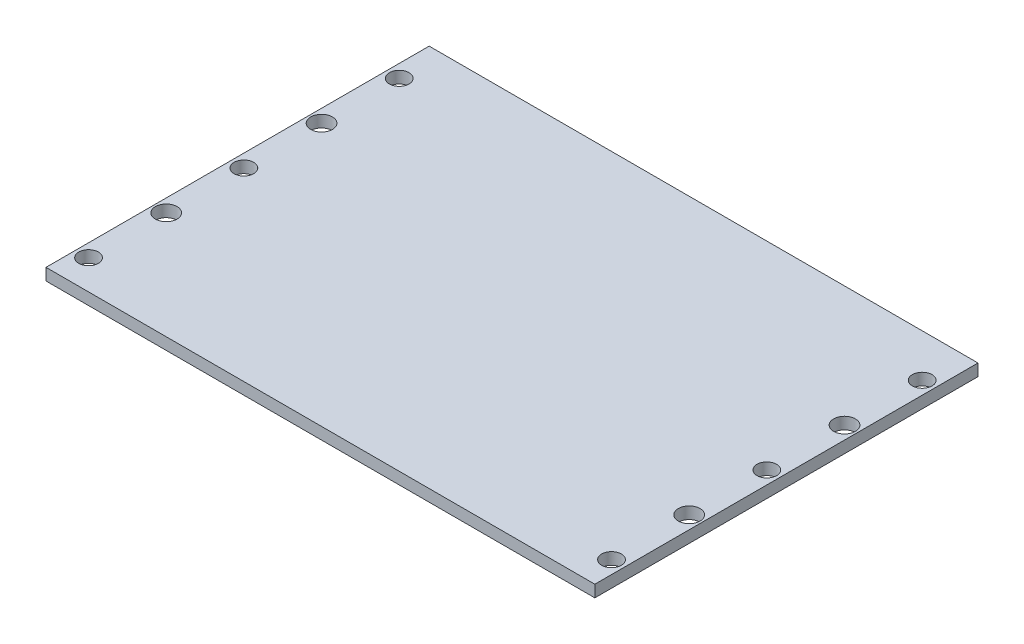
ISO-10303-21;
HEADER;
FILE_DESCRIPTION(('STEP AP214'),'2;1');
FILE_NAME('part.step','',(''),(''),'','','');
FILE_SCHEMA(('AUTOMOTIVE_DESIGN { 1 0 10303 214 1 1 1 1 }'));
ENDSEC;
DATA;
#1=APPLICATION_CONTEXT('core data for automotive mechanical design processes');
#2=APPLICATION_PROTOCOL_DEFINITION('international standard','automotive_design',2000,#1);
#3=PRODUCT_CONTEXT('',#1,'mechanical');
#4=PRODUCT('Part','Part','',(#3));
#5=PRODUCT_RELATED_PRODUCT_CATEGORY('part','',(#4));
#6=PRODUCT_DEFINITION_FORMATION('','',#4);
#7=PRODUCT_DEFINITION_CONTEXT('part definition',#1,'design');
#8=PRODUCT_DEFINITION('design','',#6,#7);
#9=PRODUCT_DEFINITION_SHAPE('','',#8);
#10=(LENGTH_UNIT() NAMED_UNIT(*) SI_UNIT(.MILLI.,.METRE.));
#11=(NAMED_UNIT(*) PLANE_ANGLE_UNIT() SI_UNIT($,.RADIAN.));
#12=(NAMED_UNIT(*) SI_UNIT($,.STERADIAN.) SOLID_ANGLE_UNIT());
#13=UNCERTAINTY_MEASURE_WITH_UNIT(LENGTH_MEASURE(1.E-05),#10,'distance_accuracy_value','');
#14=(GEOMETRIC_REPRESENTATION_CONTEXT(3) GLOBAL_UNCERTAINTY_ASSIGNED_CONTEXT((#13)) GLOBAL_UNIT_ASSIGNED_CONTEXT((#10,
#11,#12)) REPRESENTATION_CONTEXT('',''));
#15=CARTESIAN_POINT('',(0.,0.,0.));
#16=DIRECTION('',(0.,0.,1.));
#17=DIRECTION('',(1.,0.,0.));
#18=AXIS2_PLACEMENT_3D('',#15,#16,#17);
#19=CARTESIAN_POINT('',(-3.,2.29,0.));
#20=DIRECTION('',(1.,0.,0.));
#21=DIRECTION('',(0.,0.,-1.));
#22=AXIS2_PLACEMENT_3D('',#19,#20,#21);
#23=PLANE('',#22);
#24=DIRECTION('',(0.,0.,1.));
#25=VECTOR('',#24,1.);
#26=CARTESIAN_POINT('',(-3.,0.,0.));
#27=LINE('',#26,#25);
#28=CARTESIAN_POINT('',(-3.,0.,-74.));
#29=VERTEX_POINT('',#28);
#30=CARTESIAN_POINT('',(-3.,0.,0.));
#31=VERTEX_POINT('',#30);
#32=EDGE_CURVE('E96',#29,#31,#27,.T.);
#33=ORIENTED_EDGE('',*,*,#32,.T.);
#34=DIRECTION('',(0.,-1.,0.));
#35=VECTOR('',#34,1.);
#36=CARTESIAN_POINT('',(-3.,2.29,0.));
#37=LINE('',#36,#35);
#38=CARTESIAN_POINT('',(-3.,2.29,0.));
#39=VERTEX_POINT('',#38);
#40=EDGE_CURVE('E11',#39,#31,#37,.T.);
#41=ORIENTED_EDGE('',*,*,#40,.F.);
#42=DIRECTION('',(0.,0.,1.));
#43=VECTOR('',#42,1.);
#44=CARTESIAN_POINT('',(-3.,2.29,0.));
#45=LINE('',#44,#43);
#46=CARTESIAN_POINT('',(-3.,2.29,-74.));
#47=VERTEX_POINT('',#46);
#48=EDGE_CURVE('E84',#47,#39,#45,.T.);
#49=ORIENTED_EDGE('',*,*,#48,.F.);
#50=DIRECTION('',(0.,-1.,0.));
#51=VECTOR('',#50,1.);
#52=CARTESIAN_POINT('',(-3.,2.29,-74.));
#53=LINE('',#52,#51);
#54=EDGE_CURVE('E92',#47,#29,#53,.T.);
#55=ORIENTED_EDGE('',*,*,#54,.T.);
#56=EDGE_LOOP('',(#33,#41,#49,#55));
#57=FACE_BOUND('',#56,.T.);
#58=ADVANCED_FACE('F33',(#57),#23,.F.);
#59=CARTESIAN_POINT('',(-3.,2.29,0.));
#60=DIRECTION('',(0.,0.,-1.));
#61=DIRECTION('',(-1.,0.,0.));
#62=AXIS2_PLACEMENT_3D('',#59,#60,#61);
#63=PLANE('',#62);
#64=DIRECTION('',(1.,0.,0.));
#65=VECTOR('',#64,1.);
#66=CARTESIAN_POINT('',(-3.,0.,0.));
#67=LINE('',#66,#65);
#68=CARTESIAN_POINT('',(103.,0.,0.));
#69=VERTEX_POINT('',#68);
#70=EDGE_CURVE('E88',#31,#69,#67,.T.);
#71=ORIENTED_EDGE('',*,*,#70,.T.);
#72=DIRECTION('',(0.,-1.,0.));
#73=VECTOR('',#72,1.);
#74=CARTESIAN_POINT('',(103.,2.29,0.));
#75=LINE('',#74,#73);
#76=CARTESIAN_POINT('',(103.,2.29,0.));
#77=VERTEX_POINT('',#76);
#78=EDGE_CURVE('E41',#77,#69,#75,.T.);
#79=ORIENTED_EDGE('',*,*,#78,.F.);
#80=DIRECTION('',(1.,0.,0.));
#81=VECTOR('',#80,1.);
#82=CARTESIAN_POINT('',(-3.,2.29,0.));
#83=LINE('',#82,#81);
#84=EDGE_CURVE('E79',#39,#77,#83,.T.);
#85=ORIENTED_EDGE('',*,*,#84,.F.);
#86=ORIENTED_EDGE('',*,*,#40,.T.);
#87=EDGE_LOOP('',(#71,#79,#85,#86));
#88=FACE_BOUND('',#87,.T.);
#89=ADVANCED_FACE('F87',(#88),#63,.F.);
#90=CARTESIAN_POINT('',(103.,2.29,0.));
#91=DIRECTION('',(-1.,0.,0.));
#92=DIRECTION('',(0.,0.,1.));
#93=AXIS2_PLACEMENT_3D('',#90,#91,#92);
#94=PLANE('',#93);
#95=DIRECTION('',(0.,0.,-1.));
#96=VECTOR('',#95,1.);
#97=CARTESIAN_POINT('',(103.,0.,0.));
#98=LINE('',#97,#96);
#99=CARTESIAN_POINT('',(103.,0.,-74.));
#100=VERTEX_POINT('',#99);
#101=EDGE_CURVE('E66',#69,#100,#98,.T.);
#102=ORIENTED_EDGE('',*,*,#101,.T.);
#103=DIRECTION('',(0.,-1.,0.));
#104=VECTOR('',#103,1.);
#105=CARTESIAN_POINT('',(103.,2.29,-74.));
#106=LINE('',#105,#104);
#107=CARTESIAN_POINT('',(103.,2.29,-74.));
#108=VERTEX_POINT('',#107);
#109=EDGE_CURVE('E89',#108,#100,#106,.T.);
#110=ORIENTED_EDGE('',*,*,#109,.F.);
#111=DIRECTION('',(0.,0.,-1.));
#112=VECTOR('',#111,1.);
#113=CARTESIAN_POINT('',(103.,2.29,0.));
#114=LINE('',#113,#112);
#115=EDGE_CURVE('E82',#77,#108,#114,.T.);
#116=ORIENTED_EDGE('',*,*,#115,.F.);
#117=ORIENTED_EDGE('',*,*,#78,.T.);
#118=EDGE_LOOP('',(#102,#110,#116,#117));
#119=FACE_BOUND('',#118,.T.);
#120=ADVANCED_FACE('F90',(#119),#94,.F.);
#121=CARTESIAN_POINT('',(-3.,2.29,-74.));
#122=DIRECTION('',(0.,0.,1.));
#123=DIRECTION('',(1.,0.,0.));
#124=AXIS2_PLACEMENT_3D('',#121,#122,#123);
#125=PLANE('',#124);
#126=DIRECTION('',(-1.,0.,0.));
#127=VECTOR('',#126,1.);
#128=CARTESIAN_POINT('',(-3.,0.,-74.));
#129=LINE('',#128,#127);
#130=EDGE_CURVE('E72',#100,#29,#129,.T.);
#131=ORIENTED_EDGE('',*,*,#130,.T.);
#132=ORIENTED_EDGE('',*,*,#54,.F.);
#133=DIRECTION('',(-1.,0.,0.));
#134=VECTOR('',#133,1.);
#135=CARTESIAN_POINT('',(-3.,2.29,-74.));
#136=LINE('',#135,#134);
#137=EDGE_CURVE('E49',#108,#47,#136,.T.);
#138=ORIENTED_EDGE('',*,*,#137,.F.);
#139=ORIENTED_EDGE('',*,*,#109,.T.);
#140=EDGE_LOOP('',(#131,#132,#138,#139));
#141=FACE_BOUND('',#140,.T.);
#142=ADVANCED_FACE('F104',(#141),#125,.F.);
#143=CARTESIAN_POINT('',(0.,2.29,0.));
#144=DIRECTION('',(0.,-1.,0.));
#145=DIRECTION('',(0.,0.,-1.));
#146=AXIS2_PLACEMENT_3D('',#143,#144,#145);
#147=PLANE('',#146);
#148=CARTESIAN_POINT('',(-0.500000000000105,2.29,-50.72));
#149=DIRECTION('',(0.,1.,0.));
#150=DIRECTION('',(0.,0.,1.));
#151=AXIS2_PLACEMENT_3D('',#148,#149,#150);
#152=CIRCLE('',#151,2.1);
#153=CARTESIAN_POINT('',(-0.500000000000105,2.29,-48.62));
#154=VERTEX_POINT('',#153);
#155=EDGE_CURVE('E164',#154,#154,#152,.T.);
#156=ORIENTED_EDGE('',*,*,#155,.F.);
#157=EDGE_LOOP('',(#156));
#158=FACE_BOUND('',#157,.T.);
#159=CARTESIAN_POINT('',(100.5,2.29,-50.72));
#160=DIRECTION('',(0.,1.,0.));
#161=DIRECTION('',(0.,0.,1.));
#162=AXIS2_PLACEMENT_3D('',#159,#160,#161);
#163=CIRCLE('',#162,2.1);
#164=CARTESIAN_POINT('',(100.5,2.29,-48.62));
#165=VERTEX_POINT('',#164);
#166=EDGE_CURVE('E158',#165,#165,#163,.T.);
#167=ORIENTED_EDGE('',*,*,#166,.F.);
#168=EDGE_LOOP('',(#167));
#169=FACE_BOUND('',#168,.T.);
#170=CARTESIAN_POINT('',(100.5,2.29,-20.72));
#171=DIRECTION('',(0.,1.,0.));
#172=DIRECTION('',(0.,0.,1.));
#173=AXIS2_PLACEMENT_3D('',#170,#171,#172);
#174=CIRCLE('',#173,2.1);
#175=CARTESIAN_POINT('',(100.5,2.29,-18.62));
#176=VERTEX_POINT('',#175);
#177=EDGE_CURVE('E152',#176,#176,#174,.T.);
#178=ORIENTED_EDGE('',*,*,#177,.F.);
#179=EDGE_LOOP('',(#178));
#180=FACE_BOUND('',#179,.T.);
#181=CARTESIAN_POINT('',(-0.50000000000021,2.29,-65.72));
#182=DIRECTION('',(0.,1.,0.));
#183=DIRECTION('',(0.,0.,1.));
#184=AXIS2_PLACEMENT_3D('',#181,#182,#183);
#185=CIRCLE('',#184,1.9);
#186=CARTESIAN_POINT('',(-0.50000000000021,2.29,-63.82));
#187=VERTEX_POINT('',#186);
#188=EDGE_CURVE('E146',#187,#187,#185,.T.);
#189=ORIENTED_EDGE('',*,*,#188,.F.);
#190=EDGE_LOOP('',(#189));
#191=FACE_BOUND('',#190,.T.);
#192=CARTESIAN_POINT('',(-0.500000000000105,2.29,-35.72));
#193=DIRECTION('',(0.,1.,0.));
#194=DIRECTION('',(0.,0.,1.));
#195=AXIS2_PLACEMENT_3D('',#192,#193,#194);
#196=CIRCLE('',#195,1.9);
#197=CARTESIAN_POINT('',(-0.500000000000105,2.29,-33.82));
#198=VERTEX_POINT('',#197);
#199=EDGE_CURVE('E140',#198,#198,#196,.T.);
#200=ORIENTED_EDGE('',*,*,#199,.F.);
#201=EDGE_LOOP('',(#200));
#202=FACE_BOUND('',#201,.T.);
#203=CARTESIAN_POINT('',(100.5,2.29,-65.72));
#204=DIRECTION('',(0.,1.,0.));
#205=DIRECTION('',(0.,0.,1.));
#206=AXIS2_PLACEMENT_3D('',#203,#204,#205);
#207=CIRCLE('',#206,1.9);
#208=CARTESIAN_POINT('',(100.5,2.29,-63.82));
#209=VERTEX_POINT('',#208);
#210=EDGE_CURVE('E134',#209,#209,#207,.T.);
#211=ORIENTED_EDGE('',*,*,#210,.F.);
#212=EDGE_LOOP('',(#211));
#213=FACE_BOUND('',#212,.T.);
#214=CARTESIAN_POINT('',(100.5,2.29,-35.72));
#215=DIRECTION('',(0.,1.,0.));
#216=DIRECTION('',(0.,0.,1.));
#217=AXIS2_PLACEMENT_3D('',#214,#215,#216);
#218=CIRCLE('',#217,1.9);
#219=CARTESIAN_POINT('',(100.5,2.29,-33.82));
#220=VERTEX_POINT('',#219);
#221=EDGE_CURVE('E128',#220,#220,#218,.T.);
#222=ORIENTED_EDGE('',*,*,#221,.F.);
#223=EDGE_LOOP('',(#222));
#224=FACE_BOUND('',#223,.T.);
#225=CARTESIAN_POINT('',(100.5,2.29,-5.72));
#226=DIRECTION('',(0.,1.,0.));
#227=DIRECTION('',(0.,0.,1.));
#228=AXIS2_PLACEMENT_3D('',#225,#226,#227);
#229=CIRCLE('',#228,1.9);
#230=CARTESIAN_POINT('',(100.5,2.29,-3.82));
#231=VERTEX_POINT('',#230);
#232=EDGE_CURVE('E122',#231,#231,#229,.T.);
#233=ORIENTED_EDGE('',*,*,#232,.F.);
#234=EDGE_LOOP('',(#233));
#235=FACE_BOUND('',#234,.T.);
#236=CARTESIAN_POINT('',(-0.5,2.29,-20.72));
#237=DIRECTION('',(0.,1.,0.));
#238=DIRECTION('',(0.,0.,1.));
#239=AXIS2_PLACEMENT_3D('',#236,#237,#238);
#240=CIRCLE('',#239,2.1);
#241=CARTESIAN_POINT('',(-0.5,2.29,-18.62));
#242=VERTEX_POINT('',#241);
#243=EDGE_CURVE('E116',#242,#242,#240,.T.);
#244=ORIENTED_EDGE('',*,*,#243,.F.);
#245=EDGE_LOOP('',(#244));
#246=FACE_BOUND('',#245,.T.);
#247=CARTESIAN_POINT('',(-0.5,2.29,-5.72));
#248=DIRECTION('',(0.,1.,0.));
#249=DIRECTION('',(0.,0.,1.));
#250=AXIS2_PLACEMENT_3D('',#247,#248,#249);
#251=CIRCLE('',#250,1.9);
#252=CARTESIAN_POINT('',(-0.5,2.29,-3.82));
#253=VERTEX_POINT('',#252);
#254=EDGE_CURVE('E110',#253,#253,#251,.T.);
#255=ORIENTED_EDGE('',*,*,#254,.F.);
#256=EDGE_LOOP('',(#255));
#257=FACE_BOUND('',#256,.T.);
#258=ORIENTED_EDGE('',*,*,#48,.T.);
#259=ORIENTED_EDGE('',*,*,#84,.T.);
#260=ORIENTED_EDGE('',*,*,#115,.T.);
#261=ORIENTED_EDGE('',*,*,#137,.T.);
#262=EDGE_LOOP('',(#258,#259,#260,#261));
#263=FACE_BOUND('',#262,.T.);
#264=ADVANCED_FACE('F80',(#158,#169,#180,#191,#202,#213,#224,#235,#246,#257,#263),#147,.F.);
#265=CARTESIAN_POINT('',(0.,0.,0.));
#266=DIRECTION('',(0.,-1.,0.));
#267=DIRECTION('',(0.,0.,-1.));
#268=AXIS2_PLACEMENT_3D('',#265,#266,#267);
#269=PLANE('',#268);
#270=CARTESIAN_POINT('',(-0.500000000000105,0.,-50.72));
#271=DIRECTION('',(0.,1.,0.));
#272=DIRECTION('',(0.,0.,1.));
#273=AXIS2_PLACEMENT_3D('',#270,#271,#272);
#274=CIRCLE('',#273,2.1);
#275=CARTESIAN_POINT('',(-0.500000000000105,0.,-48.62));
#276=VERTEX_POINT('',#275);
#277=EDGE_CURVE('E161',#276,#276,#274,.T.);
#278=ORIENTED_EDGE('',*,*,#277,.T.);
#279=EDGE_LOOP('',(#278));
#280=FACE_BOUND('',#279,.T.);
#281=CARTESIAN_POINT('',(100.5,0.,-50.72));
#282=DIRECTION('',(0.,1.,0.));
#283=DIRECTION('',(0.,0.,1.));
#284=AXIS2_PLACEMENT_3D('',#281,#282,#283);
#285=CIRCLE('',#284,2.1);
#286=CARTESIAN_POINT('',(100.5,0.,-48.62));
#287=VERTEX_POINT('',#286);
#288=EDGE_CURVE('E155',#287,#287,#285,.T.);
#289=ORIENTED_EDGE('',*,*,#288,.T.);
#290=EDGE_LOOP('',(#289));
#291=FACE_BOUND('',#290,.T.);
#292=CARTESIAN_POINT('',(100.5,0.,-20.72));
#293=DIRECTION('',(0.,1.,0.));
#294=DIRECTION('',(0.,0.,1.));
#295=AXIS2_PLACEMENT_3D('',#292,#293,#294);
#296=CIRCLE('',#295,2.1);
#297=CARTESIAN_POINT('',(100.5,0.,-18.62));
#298=VERTEX_POINT('',#297);
#299=EDGE_CURVE('E149',#298,#298,#296,.T.);
#300=ORIENTED_EDGE('',*,*,#299,.T.);
#301=EDGE_LOOP('',(#300));
#302=FACE_BOUND('',#301,.T.);
#303=CARTESIAN_POINT('',(-0.50000000000021,0.,-65.72));
#304=DIRECTION('',(0.,1.,0.));
#305=DIRECTION('',(0.,0.,1.));
#306=AXIS2_PLACEMENT_3D('',#303,#304,#305);
#307=CIRCLE('',#306,1.9);
#308=CARTESIAN_POINT('',(-0.50000000000021,0.,-63.82));
#309=VERTEX_POINT('',#308);
#310=EDGE_CURVE('E143',#309,#309,#307,.T.);
#311=ORIENTED_EDGE('',*,*,#310,.T.);
#312=EDGE_LOOP('',(#311));
#313=FACE_BOUND('',#312,.T.);
#314=CARTESIAN_POINT('',(-0.500000000000105,0.,-35.72));
#315=DIRECTION('',(0.,1.,0.));
#316=DIRECTION('',(0.,0.,1.));
#317=AXIS2_PLACEMENT_3D('',#314,#315,#316);
#318=CIRCLE('',#317,1.9);
#319=CARTESIAN_POINT('',(-0.500000000000105,0.,-33.82));
#320=VERTEX_POINT('',#319);
#321=EDGE_CURVE('E137',#320,#320,#318,.T.);
#322=ORIENTED_EDGE('',*,*,#321,.T.);
#323=EDGE_LOOP('',(#322));
#324=FACE_BOUND('',#323,.T.);
#325=CARTESIAN_POINT('',(100.5,0.,-65.72));
#326=DIRECTION('',(0.,1.,0.));
#327=DIRECTION('',(0.,0.,1.));
#328=AXIS2_PLACEMENT_3D('',#325,#326,#327);
#329=CIRCLE('',#328,1.9);
#330=CARTESIAN_POINT('',(100.5,0.,-63.82));
#331=VERTEX_POINT('',#330);
#332=EDGE_CURVE('E131',#331,#331,#329,.T.);
#333=ORIENTED_EDGE('',*,*,#332,.T.);
#334=EDGE_LOOP('',(#333));
#335=FACE_BOUND('',#334,.T.);
#336=CARTESIAN_POINT('',(100.5,0.,-35.72));
#337=DIRECTION('',(0.,1.,0.));
#338=DIRECTION('',(0.,0.,1.));
#339=AXIS2_PLACEMENT_3D('',#336,#337,#338);
#340=CIRCLE('',#339,1.9);
#341=CARTESIAN_POINT('',(100.5,0.,-33.82));
#342=VERTEX_POINT('',#341);
#343=EDGE_CURVE('E125',#342,#342,#340,.T.);
#344=ORIENTED_EDGE('',*,*,#343,.T.);
#345=EDGE_LOOP('',(#344));
#346=FACE_BOUND('',#345,.T.);
#347=CARTESIAN_POINT('',(100.5,0.,-5.72));
#348=DIRECTION('',(0.,1.,0.));
#349=DIRECTION('',(0.,0.,1.));
#350=AXIS2_PLACEMENT_3D('',#347,#348,#349);
#351=CIRCLE('',#350,1.9);
#352=CARTESIAN_POINT('',(100.5,0.,-3.82));
#353=VERTEX_POINT('',#352);
#354=EDGE_CURVE('E119',#353,#353,#351,.T.);
#355=ORIENTED_EDGE('',*,*,#354,.T.);
#356=EDGE_LOOP('',(#355));
#357=FACE_BOUND('',#356,.T.);
#358=CARTESIAN_POINT('',(-0.5,0.,-20.72));
#359=DIRECTION('',(0.,1.,0.));
#360=DIRECTION('',(0.,0.,1.));
#361=AXIS2_PLACEMENT_3D('',#358,#359,#360);
#362=CIRCLE('',#361,2.1);
#363=CARTESIAN_POINT('',(-0.5,0.,-18.62));
#364=VERTEX_POINT('',#363);
#365=EDGE_CURVE('E113',#364,#364,#362,.T.);
#366=ORIENTED_EDGE('',*,*,#365,.T.);
#367=EDGE_LOOP('',(#366));
#368=FACE_BOUND('',#367,.T.);
#369=CARTESIAN_POINT('',(-0.5,0.,-5.72));
#370=DIRECTION('',(0.,1.,0.));
#371=DIRECTION('',(0.,0.,1.));
#372=AXIS2_PLACEMENT_3D('',#369,#370,#371);
#373=CIRCLE('',#372,1.9);
#374=CARTESIAN_POINT('',(-0.5,0.,-3.82));
#375=VERTEX_POINT('',#374);
#376=EDGE_CURVE('E99',#375,#375,#373,.T.);
#377=ORIENTED_EDGE('',*,*,#376,.T.);
#378=EDGE_LOOP('',(#377));
#379=FACE_BOUND('',#378,.T.);
#380=ORIENTED_EDGE('',*,*,#32,.F.);
#381=ORIENTED_EDGE('',*,*,#130,.F.);
#382=ORIENTED_EDGE('',*,*,#101,.F.);
#383=ORIENTED_EDGE('',*,*,#70,.F.);
#384=EDGE_LOOP('',(#380,#381,#382,#383));
#385=FACE_BOUND('',#384,.T.);
#386=ADVANCED_FACE('F107',(#280,#291,#302,#313,#324,#335,#346,#357,#368,#379,#385),#269,.T.);
#387=CARTESIAN_POINT('',(-0.5,0.,-5.72));
#388=DIRECTION('',(0.,1.,0.));
#389=DIRECTION('',(0.,0.,1.));
#390=AXIS2_PLACEMENT_3D('',#387,#388,#389);
#391=CYLINDRICAL_SURFACE('',#390,1.9);
#392=ORIENTED_EDGE('',*,*,#376,.F.);
#393=EDGE_LOOP('',(#392));
#394=FACE_BOUND('',#393,.T.);
#395=ORIENTED_EDGE('',*,*,#254,.T.);
#396=EDGE_LOOP('',(#395));
#397=FACE_BOUND('',#396,.T.);
#398=ADVANCED_FACE('F200',(#394,#397),#391,.F.);
#399=CARTESIAN_POINT('',(-0.5,0.,-20.72));
#400=DIRECTION('',(0.,1.,0.));
#401=DIRECTION('',(0.,0.,1.));
#402=AXIS2_PLACEMENT_3D('',#399,#400,#401);
#403=CYLINDRICAL_SURFACE('',#402,2.1);
#404=ORIENTED_EDGE('',*,*,#365,.F.);
#405=EDGE_LOOP('',(#404));
#406=FACE_BOUND('',#405,.T.);
#407=ORIENTED_EDGE('',*,*,#243,.T.);
#408=EDGE_LOOP('',(#407));
#409=FACE_BOUND('',#408,.T.);
#410=ADVANCED_FACE('F202',(#406,#409),#403,.F.);
#411=CARTESIAN_POINT('',(100.5,0.,-5.72));
#412=DIRECTION('',(0.,1.,0.));
#413=DIRECTION('',(0.,0.,1.));
#414=AXIS2_PLACEMENT_3D('',#411,#412,#413);
#415=CYLINDRICAL_SURFACE('',#414,1.9);
#416=ORIENTED_EDGE('',*,*,#354,.F.);
#417=EDGE_LOOP('',(#416));
#418=FACE_BOUND('',#417,.T.);
#419=ORIENTED_EDGE('',*,*,#232,.T.);
#420=EDGE_LOOP('',(#419));
#421=FACE_BOUND('',#420,.T.);
#422=ADVANCED_FACE('F209',(#418,#421),#415,.F.);
#423=CARTESIAN_POINT('',(100.5,0.,-35.72));
#424=DIRECTION('',(0.,1.,0.));
#425=DIRECTION('',(0.,0.,1.));
#426=AXIS2_PLACEMENT_3D('',#423,#424,#425);
#427=CYLINDRICAL_SURFACE('',#426,1.9);
#428=ORIENTED_EDGE('',*,*,#343,.F.);
#429=EDGE_LOOP('',(#428));
#430=FACE_BOUND('',#429,.T.);
#431=ORIENTED_EDGE('',*,*,#221,.T.);
#432=EDGE_LOOP('',(#431));
#433=FACE_BOUND('',#432,.T.);
#434=ADVANCED_FACE('F257',(#430,#433),#427,.F.);
#435=CARTESIAN_POINT('',(100.5,0.,-65.72));
#436=DIRECTION('',(0.,1.,0.));
#437=DIRECTION('',(0.,0.,1.));
#438=AXIS2_PLACEMENT_3D('',#435,#436,#437);
#439=CYLINDRICAL_SURFACE('',#438,1.9);
#440=ORIENTED_EDGE('',*,*,#332,.F.);
#441=EDGE_LOOP('',(#440));
#442=FACE_BOUND('',#441,.T.);
#443=ORIENTED_EDGE('',*,*,#210,.T.);
#444=EDGE_LOOP('',(#443));
#445=FACE_BOUND('',#444,.T.);
#446=ADVANCED_FACE('F267',(#442,#445),#439,.F.);
#447=CARTESIAN_POINT('',(-0.500000000000105,0.,-35.72));
#448=DIRECTION('',(0.,1.,0.));
#449=DIRECTION('',(0.,0.,1.));
#450=AXIS2_PLACEMENT_3D('',#447,#448,#449);
#451=CYLINDRICAL_SURFACE('',#450,1.9);
#452=ORIENTED_EDGE('',*,*,#321,.F.);
#453=EDGE_LOOP('',(#452));
#454=FACE_BOUND('',#453,.T.);
#455=ORIENTED_EDGE('',*,*,#199,.T.);
#456=EDGE_LOOP('',(#455));
#457=FACE_BOUND('',#456,.T.);
#458=ADVANCED_FACE('F277',(#454,#457),#451,.F.);
#459=CARTESIAN_POINT('',(-0.50000000000021,0.,-65.72));
#460=DIRECTION('',(0.,1.,0.));
#461=DIRECTION('',(0.,0.,1.));
#462=AXIS2_PLACEMENT_3D('',#459,#460,#461);
#463=CYLINDRICAL_SURFACE('',#462,1.9);
#464=ORIENTED_EDGE('',*,*,#310,.F.);
#465=EDGE_LOOP('',(#464));
#466=FACE_BOUND('',#465,.T.);
#467=ORIENTED_EDGE('',*,*,#188,.T.);
#468=EDGE_LOOP('',(#467));
#469=FACE_BOUND('',#468,.T.);
#470=ADVANCED_FACE('F287',(#466,#469),#463,.F.);
#471=CARTESIAN_POINT('',(100.5,0.,-20.72));
#472=DIRECTION('',(0.,1.,0.));
#473=DIRECTION('',(0.,0.,1.));
#474=AXIS2_PLACEMENT_3D('',#471,#472,#473);
#475=CYLINDRICAL_SURFACE('',#474,2.1);
#476=ORIENTED_EDGE('',*,*,#299,.F.);
#477=EDGE_LOOP('',(#476));
#478=FACE_BOUND('',#477,.T.);
#479=ORIENTED_EDGE('',*,*,#177,.T.);
#480=EDGE_LOOP('',(#479));
#481=FACE_BOUND('',#480,.T.);
#482=ADVANCED_FACE('F297',(#478,#481),#475,.F.);
#483=CARTESIAN_POINT('',(100.5,0.,-50.72));
#484=DIRECTION('',(0.,1.,0.));
#485=DIRECTION('',(0.,0.,1.));
#486=AXIS2_PLACEMENT_3D('',#483,#484,#485);
#487=CYLINDRICAL_SURFACE('',#486,2.1);
#488=ORIENTED_EDGE('',*,*,#288,.F.);
#489=EDGE_LOOP('',(#488));
#490=FACE_BOUND('',#489,.T.);
#491=ORIENTED_EDGE('',*,*,#166,.T.);
#492=EDGE_LOOP('',(#491));
#493=FACE_BOUND('',#492,.T.);
#494=ADVANCED_FACE('F175',(#490,#493),#487,.F.);
#495=CARTESIAN_POINT('',(-0.500000000000105,0.,-50.72));
#496=DIRECTION('',(0.,1.,0.));
#497=DIRECTION('',(0.,0.,1.));
#498=AXIS2_PLACEMENT_3D('',#495,#496,#497);
#499=CYLINDRICAL_SURFACE('',#498,2.1);
#500=ORIENTED_EDGE('',*,*,#277,.F.);
#501=EDGE_LOOP('',(#500));
#502=FACE_BOUND('',#501,.T.);
#503=ORIENTED_EDGE('',*,*,#155,.T.);
#504=EDGE_LOOP('',(#503));
#505=FACE_BOUND('',#504,.T.);
#506=ADVANCED_FACE('F172',(#502,#505),#499,.F.);
#507=CLOSED_SHELL('',(#58,#89,#120,#142,#264,#386,#398,#410,#422,#434,#446,#458,#470,#482,#494,#506));
#508=MANIFOLD_SOLID_BREP('B2',#507);
#509=ADVANCED_BREP_SHAPE_REPRESENTATION('',(#18,#508),#14);
#510=SHAPE_DEFINITION_REPRESENTATION(#9,#509);
ENDSEC;
END-ISO-10303-21;
